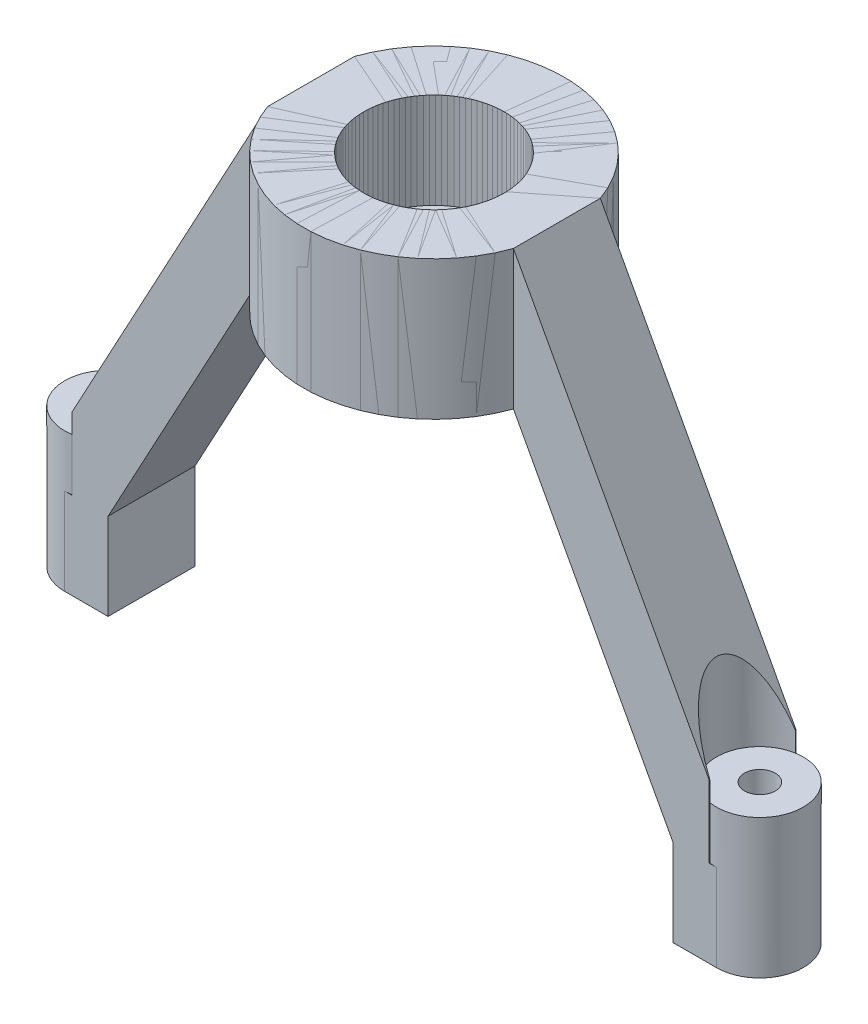
ISO-10303-21;
HEADER;
FILE_DESCRIPTION(('STEP AP214'),'2;1');
FILE_NAME('part.step','',(''),(''),'','','');
FILE_SCHEMA(('AUTOMOTIVE_DESIGN { 1 0 10303 214 1 1 1 1 }'));
ENDSEC;
DATA;
#1=APPLICATION_CONTEXT('core data for automotive mechanical design processes');
#2=APPLICATION_PROTOCOL_DEFINITION('international standard','automotive_design',2000,#1);
#3=PRODUCT_CONTEXT('',#1,'mechanical');
#4=PRODUCT('Part','Part','',(#3));
#5=PRODUCT_RELATED_PRODUCT_CATEGORY('part','',(#4));
#6=PRODUCT_DEFINITION_FORMATION('','',#4);
#7=PRODUCT_DEFINITION_CONTEXT('part definition',#1,'design');
#8=PRODUCT_DEFINITION('design','',#6,#7);
#9=PRODUCT_DEFINITION_SHAPE('','',#8);
#10=(LENGTH_UNIT() NAMED_UNIT(*) SI_UNIT(.MILLI.,.METRE.));
#11=(NAMED_UNIT(*) PLANE_ANGLE_UNIT() SI_UNIT($,.RADIAN.));
#12=(NAMED_UNIT(*) SI_UNIT($,.STERADIAN.) SOLID_ANGLE_UNIT());
#13=UNCERTAINTY_MEASURE_WITH_UNIT(LENGTH_MEASURE(1.E-05),#10,'distance_accuracy_value','');
#14=(GEOMETRIC_REPRESENTATION_CONTEXT(3) GLOBAL_UNCERTAINTY_ASSIGNED_CONTEXT((#13)) GLOBAL_UNIT_ASSIGNED_CONTEXT((#10,
#11,#12)) REPRESENTATION_CONTEXT('',''));
#15=CARTESIAN_POINT('',(0.,0.,0.));
#16=DIRECTION('',(0.,0.,1.));
#17=DIRECTION('',(1.,0.,0.));
#18=AXIS2_PLACEMENT_3D('',#15,#16,#17);
#19=CARTESIAN_POINT('',(18.75,-12.,0.));
#20=DIRECTION('',(0.,-1.,0.));
#21=DIRECTION('',(0.,0.,1.));
#22=AXIS2_PLACEMENT_3D('',#19,#20,#21);
#23=CYLINDRICAL_SURFACE('',#22,0.889);
#24=CARTESIAN_POINT('',(18.75,-14.,0.));
#25=DIRECTION('',(0.,1.,0.));
#26=DIRECTION('',(0.,0.,-1.));
#27=AXIS2_PLACEMENT_3D('',#24,#25,#26);
#28=CIRCLE('',#27,0.889);
#29=CARTESIAN_POINT('',(18.75,-14.,-0.889));
#30=VERTEX_POINT('',#29);
#31=EDGE_CURVE('E267',#30,#30,#28,.T.);
#32=ORIENTED_EDGE('',*,*,#31,.T.);
#33=EDGE_LOOP('',(#32));
#34=FACE_BOUND('',#33,.T.);
#35=CARTESIAN_POINT('',(18.75,-22.,0.));
#36=DIRECTION('',(0.,-1.,0.));
#37=DIRECTION('',(0.,0.,1.));
#38=AXIS2_PLACEMENT_3D('',#35,#36,#37);
#39=CIRCLE('',#38,0.889);
#40=CARTESIAN_POINT('',(18.75,-22.,0.889));
#41=VERTEX_POINT('',#40);
#42=EDGE_CURVE('E239',#41,#41,#39,.T.);
#43=ORIENTED_EDGE('',*,*,#42,.T.);
#44=EDGE_LOOP('',(#43));
#45=FACE_BOUND('',#44,.T.);
#46=ADVANCED_FACE('F45',(#34,#45),#23,.F.);
#47=CARTESIAN_POINT('',(18.75,-12.,0.));
#48=DIRECTION('',(0.,-1.,0.));
#49=DIRECTION('',(0.,0.,1.));
#50=AXIS2_PLACEMENT_3D('',#47,#48,#49);
#51=CYLINDRICAL_SURFACE('',#50,2.5);
#52=CARTESIAN_POINT('',(18.75,-14.,0.));
#53=DIRECTION('',(0.,1.,0.));
#54=DIRECTION('',(0.,0.,-1.));
#55=AXIS2_PLACEMENT_3D('',#52,#53,#54);
#56=CIRCLE('',#55,2.5);
#57=CARTESIAN_POINT('',(18.3373246263292,-14.,2.46570457191563));
#58=VERTEX_POINT('',#57);
#59=CARTESIAN_POINT('',(18.3373246263292,-14.,-2.46570457191563));
#60=VERTEX_POINT('',#59);
#61=EDGE_CURVE('E163',#58,#60,#56,.T.);
#62=ORIENTED_EDGE('',*,*,#61,.F.);
#63=DIRECTION('',(0.,-1.,0.));
#64=VECTOR('',#63,1.);
#65=CARTESIAN_POINT('',(18.3373246263292,-12.,2.46570457191563));
#66=LINE('',#65,#64);
#67=CARTESIAN_POINT('',(18.3373246263292,-17.,2.46570457191563));
#68=VERTEX_POINT('',#67);
#69=EDGE_CURVE('E220',#58,#68,#66,.T.);
#70=ORIENTED_EDGE('',*,*,#69,.T.);
#71=CARTESIAN_POINT('',(18.75,-17.,0.));
#72=DIRECTION('',(0.,1.,0.));
#73=DIRECTION('',(0.,0.,-1.));
#74=AXIS2_PLACEMENT_3D('',#71,#72,#73);
#75=CIRCLE('',#74,2.5);
#76=CARTESIAN_POINT('',(18.75,-17.,2.5));
#77=VERTEX_POINT('',#76);
#78=EDGE_CURVE('E12',#68,#77,#75,.T.);
#79=ORIENTED_EDGE('',*,*,#78,.T.);
#80=DIRECTION('',(0.,1.,0.));
#81=VECTOR('',#80,1.);
#82=CARTESIAN_POINT('',(18.75,-22.,2.5));
#83=LINE('',#82,#81);
#84=CARTESIAN_POINT('',(18.75,-22.,2.5));
#85=VERTEX_POINT('',#84);
#86=EDGE_CURVE('E144',#85,#77,#83,.T.);
#87=ORIENTED_EDGE('',*,*,#86,.F.);
#88=CARTESIAN_POINT('',(18.75,-22.,0.));
#89=DIRECTION('',(0.,-1.,0.));
#90=DIRECTION('',(0.,0.,1.));
#91=AXIS2_PLACEMENT_3D('',#88,#89,#90);
#92=CIRCLE('',#91,2.5);
#93=CARTESIAN_POINT('',(18.75,-22.,-2.5));
#94=VERTEX_POINT('',#93);
#95=EDGE_CURVE('E150',#94,#85,#92,.T.);
#96=ORIENTED_EDGE('',*,*,#95,.F.);
#97=DIRECTION('',(0.,1.,0.));
#98=VECTOR('',#97,1.);
#99=CARTESIAN_POINT('',(18.75,-22.,-2.5));
#100=LINE('',#99,#98);
#101=CARTESIAN_POINT('',(18.75,-17.,-2.5));
#102=VERTEX_POINT('',#101);
#103=EDGE_CURVE('E175',#94,#102,#100,.T.);
#104=ORIENTED_EDGE('',*,*,#103,.T.);
#105=CARTESIAN_POINT('',(18.3373246263292,-17.,-2.46570457191563));
#106=VERTEX_POINT('',#105);
#107=EDGE_CURVE('E53',#102,#106,#75,.T.);
#108=ORIENTED_EDGE('',*,*,#107,.T.);
#109=DIRECTION('',(0.,-1.,0.));
#110=VECTOR('',#109,1.);
#111=CARTESIAN_POINT('',(18.3373246263292,-12.,-2.46570457191563));
#112=LINE('',#111,#110);
#113=EDGE_CURVE('E215',#106,#60,#112,.F.);
#114=ORIENTED_EDGE('',*,*,#113,.T.);
#115=EDGE_LOOP('',(#62,#70,#79,#87,#96,#104,#108,#114));
#116=FACE_BOUND('',#115,.T.);
#117=ADVANCED_FACE('F162',(#116),#51,.T.);
#118=CARTESIAN_POINT('',(18.3373246263292,-12.8658656497612,2.5));
#119=DIRECTION('',(1.,0.,0.));
#120=DIRECTION('',(0.,0.,-1.));
#121=AXIS2_PLACEMENT_3D('',#118,#119,#120);
#122=PLANE('',#121);
#123=CARTESIAN_POINT('',(18.3373246263292,-12.8658656497612,2.46570457191563));
#124=VERTEX_POINT('',#123);
#125=EDGE_CURVE('E319',#124,#58,#66,.T.);
#126=ORIENTED_EDGE('',*,*,#125,.F.);
#127=DIRECTION('',(0.,0.,-1.));
#128=VECTOR('',#127,1.);
#129=CARTESIAN_POINT('',(18.3373246263292,-12.8658656497612,2.5));
#130=LINE('',#129,#128);
#131=CARTESIAN_POINT('',(18.3373246263292,-12.8658656497612,2.5));
#132=VERTEX_POINT('',#131);
#133=EDGE_CURVE('E182',#132,#124,#130,.T.);
#134=ORIENTED_EDGE('',*,*,#133,.F.);
#135=DIRECTION('',(0.,-1.,0.));
#136=VECTOR('',#135,1.);
#137=CARTESIAN_POINT('',(18.3373246263292,-12.8658656497612,2.5));
#138=LINE('',#137,#136);
#139=CARTESIAN_POINT('',(18.3373246263292,-17.,2.5));
#140=VERTEX_POINT('',#139);
#141=EDGE_CURVE('E195',#132,#140,#138,.T.);
#142=ORIENTED_EDGE('',*,*,#141,.T.);
#143=DIRECTION('',(0.,0.,-1.));
#144=VECTOR('',#143,1.);
#145=CARTESIAN_POINT('',(18.3373246263292,-17.,2.5));
#146=LINE('',#145,#144);
#147=EDGE_CURVE('E181',#140,#68,#146,.T.);
#148=ORIENTED_EDGE('',*,*,#147,.T.);
#149=ORIENTED_EDGE('',*,*,#69,.F.);
#150=EDGE_LOOP('',(#126,#134,#142,#148,#149));
#151=FACE_BOUND('',#150,.T.);
#152=ADVANCED_FACE('F264',(#151),#122,.T.);
#153=ORIENTED_EDGE('',*,*,#113,.F.);
#154=CARTESIAN_POINT('',(18.3373246263292,-17.,-2.5));
#155=VERTEX_POINT('',#154);
#156=EDGE_CURVE('E179',#106,#155,#146,.T.);
#157=ORIENTED_EDGE('',*,*,#156,.T.);
#158=DIRECTION('',(0.,-1.,0.));
#159=VECTOR('',#158,1.);
#160=CARTESIAN_POINT('',(18.3373246263292,-12.8658656497612,-2.5));
#161=LINE('',#160,#159);
#162=CARTESIAN_POINT('',(18.3373246263292,-12.8658656497612,-2.5));
#163=VERTEX_POINT('',#162);
#164=EDGE_CURVE('E183',#163,#155,#161,.T.);
#165=ORIENTED_EDGE('',*,*,#164,.F.);
#166=CARTESIAN_POINT('',(18.3373246263292,-12.8658656497612,-2.46570457191563));
#167=VERTEX_POINT('',#166);
#168=EDGE_CURVE('E327',#167,#163,#130,.T.);
#169=ORIENTED_EDGE('',*,*,#168,.F.);
#170=DIRECTION('',(0.,1.,0.));
#171=VECTOR('',#170,1.);
#172=CARTESIAN_POINT('',(18.3373246263292,-14.,-2.46570457191563));
#173=LINE('',#172,#171);
#174=EDGE_CURVE('E270',#60,#167,#173,.T.);
#175=ORIENTED_EDGE('',*,*,#174,.F.);
#176=EDGE_LOOP('',(#153,#157,#165,#169,#175));
#177=FACE_BOUND('',#176,.T.);
#178=ADVANCED_FACE('F315',(#177),#122,.T.);
#179=CARTESIAN_POINT('',(16.25,-17.,2.5));
#180=DIRECTION('',(-0.879928504434249,-0.475106121918153,0.));
#181=DIRECTION('',(-0.475106121918153,0.879928504434249,0.));
#182=AXIS2_PLACEMENT_3D('',#179,#180,#181);
#183=PLANE('',#182);
#184=DIRECTION('',(0.,0.,-1.));
#185=VECTOR('',#184,1.);
#186=CARTESIAN_POINT('',(7.07106781186548,0.,2.5));
#187=LINE('',#186,#185);
#188=CARTESIAN_POINT('',(7.07106781186548,0.,2.5));
#189=VERTEX_POINT('',#188);
#190=CARTESIAN_POINT('',(7.07106781186548,0.,-2.5));
#191=VERTEX_POINT('',#190);
#192=EDGE_CURVE('E214',#189,#191,#187,.T.);
#193=ORIENTED_EDGE('',*,*,#192,.T.);
#194=DIRECTION('',(-0.475106121918153,0.879928504434249,0.));
#195=VECTOR('',#194,1.);
#196=CARTESIAN_POINT('',(16.25,-17.,-2.5));
#197=LINE('',#196,#195);
#198=CARTESIAN_POINT('',(16.25,-17.,-2.5));
#199=VERTEX_POINT('',#198);
#200=EDGE_CURVE('E211',#199,#191,#197,.T.);
#201=ORIENTED_EDGE('',*,*,#200,.F.);
#202=DIRECTION('',(0.,0.,-1.));
#203=VECTOR('',#202,1.);
#204=CARTESIAN_POINT('',(16.25,-17.,2.5));
#205=LINE('',#204,#203);
#206=CARTESIAN_POINT('',(16.25,-17.,2.5));
#207=VERTEX_POINT('',#206);
#208=EDGE_CURVE('E187',#207,#199,#205,.T.);
#209=ORIENTED_EDGE('',*,*,#208,.F.);
#210=DIRECTION('',(-0.475106121918153,0.879928504434249,0.));
#211=VECTOR('',#210,1.);
#212=CARTESIAN_POINT('',(16.25,-17.,2.5));
#213=LINE('',#212,#211);
#214=EDGE_CURVE('E196',#207,#189,#213,.T.);
#215=ORIENTED_EDGE('',*,*,#214,.T.);
#216=EDGE_LOOP('',(#193,#201,#209,#215));
#217=FACE_BOUND('',#216,.T.);
#218=ADVANCED_FACE('F367',(#217),#183,.T.);
#219=CARTESIAN_POINT('',(7.07106781186548,8.,2.5));
#220=DIRECTION('',(0.879928504434249,0.475106121918153,0.));
#221=DIRECTION('',(0.475106121918153,-0.879928504434249,0.));
#222=AXIS2_PLACEMENT_3D('',#219,#220,#221);
#223=PLANE('',#222);
#224=CARTESIAN_POINT('',(18.75,-13.6301682079032,0.));
#225=DIRECTION('',(0.879928504434249,0.475106121918153,0.));
#226=DIRECTION('',(0.475106121918153,-0.879928504434249,0.));
#227=AXIS2_PLACEMENT_3D('',#224,#225,#226);
#228=ELLIPSE('',#227,5.26198229125466,2.5);
#229=EDGE_CURVE('E318',#167,#124,#228,.T.);
#230=ORIENTED_EDGE('',*,*,#229,.F.);
#231=ORIENTED_EDGE('',*,*,#168,.T.);
#232=DIRECTION('',(0.475106121918153,-0.879928504434249,0.));
#233=VECTOR('',#232,1.);
#234=CARTESIAN_POINT('',(7.07106781186548,8.,-2.5));
#235=LINE('',#234,#233);
#236=CARTESIAN_POINT('',(7.07106781186548,8.,-2.5));
#237=VERTEX_POINT('',#236);
#238=EDGE_CURVE('E308',#237,#163,#235,.T.);
#239=ORIENTED_EDGE('',*,*,#238,.F.);
#240=DIRECTION('',(0.,0.,-1.));
#241=VECTOR('',#240,1.);
#242=CARTESIAN_POINT('',(7.07106781186548,8.,2.5));
#243=LINE('',#242,#241);
#244=CARTESIAN_POINT('',(7.07106781186548,8.,2.5));
#245=VERTEX_POINT('',#244);
#246=EDGE_CURVE('E202',#245,#237,#243,.T.);
#247=ORIENTED_EDGE('',*,*,#246,.F.);
#248=DIRECTION('',(0.475106121918153,-0.879928504434249,0.));
#249=VECTOR('',#248,1.);
#250=CARTESIAN_POINT('',(7.07106781186548,8.,2.5));
#251=LINE('',#250,#249);
#252=EDGE_CURVE('E197',#245,#132,#251,.T.);
#253=ORIENTED_EDGE('',*,*,#252,.T.);
#254=ORIENTED_EDGE('',*,*,#133,.T.);
#255=EDGE_LOOP('',(#230,#231,#239,#247,#253,#254));
#256=FACE_BOUND('',#255,.T.);
#257=ADVANCED_FACE('F329',(#256),#223,.T.);
#258=CARTESIAN_POINT('',(0.,0.,2.5));
#259=DIRECTION('',(0.,0.,1.));
#260=DIRECTION('',(1.,0.,0.));
#261=AXIS2_PLACEMENT_3D('',#258,#259,#260);
#262=PLANE('',#261);
#263=DIRECTION('',(0.,1.,0.));
#264=VECTOR('',#263,1.);
#265=CARTESIAN_POINT('',(7.07106781186548,0.,2.5));
#266=LINE('',#265,#264);
#267=EDGE_CURVE('E205',#189,#245,#266,.T.);
#268=ORIENTED_EDGE('',*,*,#267,.F.);
#269=ORIENTED_EDGE('',*,*,#214,.F.);
#270=DIRECTION('',(0.,1.,0.));
#271=VECTOR('',#270,1.);
#272=CARTESIAN_POINT('',(16.25,-22.,2.5));
#273=LINE('',#272,#271);
#274=CARTESIAN_POINT('',(16.25,-22.,2.5));
#275=VERTEX_POINT('',#274);
#276=EDGE_CURVE('E146',#275,#207,#273,.T.);
#277=ORIENTED_EDGE('',*,*,#276,.F.);
#278=DIRECTION('',(-1.,0.,0.));
#279=VECTOR('',#278,1.);
#280=CARTESIAN_POINT('',(18.75,-22.,2.5));
#281=LINE('',#280,#279);
#282=EDGE_CURVE('E140',#85,#275,#281,.T.);
#283=ORIENTED_EDGE('',*,*,#282,.F.);
#284=ORIENTED_EDGE('',*,*,#86,.T.);
#285=DIRECTION('',(-1.,0.,0.));
#286=VECTOR('',#285,1.);
#287=CARTESIAN_POINT('',(18.75,-17.,2.5));
#288=LINE('',#287,#286);
#289=EDGE_CURVE('E238',#77,#140,#288,.T.);
#290=ORIENTED_EDGE('',*,*,#289,.T.);
#291=ORIENTED_EDGE('',*,*,#141,.F.);
#292=ORIENTED_EDGE('',*,*,#252,.F.);
#293=EDGE_LOOP('',(#268,#269,#277,#283,#284,#290,#291,#292));
#294=FACE_BOUND('',#293,.T.);
#295=ADVANCED_FACE('F142',(#294),#262,.T.);
#296=CARTESIAN_POINT('',(0.,0.,-2.5));
#297=DIRECTION('',(0.,0.,1.));
#298=DIRECTION('',(1.,0.,0.));
#299=AXIS2_PLACEMENT_3D('',#296,#297,#298);
#300=PLANE('',#299);
#301=DIRECTION('',(0.,1.,0.));
#302=VECTOR('',#301,1.);
#303=CARTESIAN_POINT('',(7.07106781186548,0.,-2.5));
#304=LINE('',#303,#302);
#305=EDGE_CURVE('E304',#191,#237,#304,.T.);
#306=ORIENTED_EDGE('',*,*,#305,.T.);
#307=ORIENTED_EDGE('',*,*,#238,.T.);
#308=ORIENTED_EDGE('',*,*,#164,.T.);
#309=DIRECTION('',(1.,0.,0.));
#310=VECTOR('',#309,1.);
#311=CARTESIAN_POINT('',(16.25,-17.,-2.5));
#312=LINE('',#311,#310);
#313=EDGE_CURVE('E159',#155,#102,#312,.T.);
#314=ORIENTED_EDGE('',*,*,#313,.T.);
#315=ORIENTED_EDGE('',*,*,#103,.F.);
#316=DIRECTION('',(1.,0.,0.));
#317=VECTOR('',#316,1.);
#318=CARTESIAN_POINT('',(16.25,-22.,-2.5));
#319=LINE('',#318,#317);
#320=CARTESIAN_POINT('',(16.25,-22.,-2.5));
#321=VERTEX_POINT('',#320);
#322=EDGE_CURVE('E156',#321,#94,#319,.T.);
#323=ORIENTED_EDGE('',*,*,#322,.F.);
#324=DIRECTION('',(0.,1.,0.));
#325=VECTOR('',#324,1.);
#326=CARTESIAN_POINT('',(16.25,-22.,-2.5));
#327=LINE('',#326,#325);
#328=EDGE_CURVE('E167',#321,#199,#327,.T.);
#329=ORIENTED_EDGE('',*,*,#328,.T.);
#330=ORIENTED_EDGE('',*,*,#200,.T.);
#331=EDGE_LOOP('',(#306,#307,#308,#314,#315,#323,#329,#330));
#332=FACE_BOUND('',#331,.T.);
#333=ADVANCED_FACE('F230',(#332),#300,.F.);
#334=CARTESIAN_POINT('',(0.,8.,0.));
#335=DIRECTION('',(0.,-1.,0.));
#336=DIRECTION('',(0.,0.,1.));
#337=AXIS2_PLACEMENT_3D('',#334,#335,#336);
#338=CYLINDRICAL_SURFACE('',#337,1.875);
#339=CARTESIAN_POINT('',(0.,0.,0.));
#340=DIRECTION('',(0.,1.,0.));
#341=DIRECTION('',(0.,0.,-1.));
#342=AXIS2_PLACEMENT_3D('',#339,#340,#341);
#343=CIRCLE('',#342,1.875);
#344=CARTESIAN_POINT('',(0.,0.,-1.875));
#345=VERTEX_POINT('',#344);
#346=EDGE_CURVE('E290',#345,#345,#343,.T.);
#347=ORIENTED_EDGE('',*,*,#346,.F.);
#348=EDGE_LOOP('',(#347));
#349=FACE_BOUND('',#348,.T.);
#350=CARTESIAN_POINT('',(0.,2.5,0.));
#351=DIRECTION('',(0.,1.,0.));
#352=DIRECTION('',(0.,0.,-1.));
#353=AXIS2_PLACEMENT_3D('',#350,#351,#352);
#354=CIRCLE('',#353,1.875);
#355=CARTESIAN_POINT('',(0.,2.5,-1.875));
#356=VERTEX_POINT('',#355);
#357=EDGE_CURVE('E278',#356,#356,#354,.T.);
#358=ORIENTED_EDGE('',*,*,#357,.T.);
#359=EDGE_LOOP('',(#358));
#360=FACE_BOUND('',#359,.T.);
#361=ADVANCED_FACE('F359',(#349,#360),#338,.F.);
#362=CARTESIAN_POINT('',(-7.07106781186548,8.,0.));
#363=DIRECTION('',(-1.,0.,0.));
#364=DIRECTION('',(0.,0.,1.));
#365=AXIS2_PLACEMENT_3D('',#362,#363,#364);
#366=PLANE('',#365);
#367=DIRECTION('',(0.,0.,-1.));
#368=VECTOR('',#367,1.);
#369=CARTESIAN_POINT('',(-7.07106781186548,0.,0.));
#370=LINE('',#369,#368);
#371=CARTESIAN_POINT('',(-7.07106781186548,0.,2.5));
#372=VERTEX_POINT('',#371);
#373=CARTESIAN_POINT('',(-7.07106781186548,0.,-2.5));
#374=VERTEX_POINT('',#373);
#375=EDGE_CURVE('E293',#372,#374,#370,.T.);
#376=ORIENTED_EDGE('',*,*,#375,.F.);
#377=DIRECTION('',(0.,-1.,0.));
#378=VECTOR('',#377,1.);
#379=CARTESIAN_POINT('',(-7.07106781186548,8.,2.5));
#380=LINE('',#379,#378);
#381=CARTESIAN_POINT('',(-7.07106781186548,8.,2.5));
#382=VERTEX_POINT('',#381);
#383=EDGE_CURVE('E302',#382,#372,#380,.T.);
#384=ORIENTED_EDGE('',*,*,#383,.F.);
#385=DIRECTION('',(0.,0.,-1.));
#386=VECTOR('',#385,1.);
#387=CARTESIAN_POINT('',(-7.07106781186548,8.,0.));
#388=LINE('',#387,#386);
#389=CARTESIAN_POINT('',(-7.07106781186548,8.,-2.5));
#390=VERTEX_POINT('',#389);
#391=EDGE_CURVE('E280',#382,#390,#388,.T.);
#392=ORIENTED_EDGE('',*,*,#391,.T.);
#393=DIRECTION('',(0.,-1.,0.));
#394=VECTOR('',#393,1.);
#395=CARTESIAN_POINT('',(-7.07106781186548,8.,-2.5));
#396=LINE('',#395,#394);
#397=EDGE_CURVE('E289',#390,#374,#396,.T.);
#398=ORIENTED_EDGE('',*,*,#397,.T.);
#399=EDGE_LOOP('',(#376,#384,#392,#398));
#400=FACE_BOUND('',#399,.T.);
#401=ADVANCED_FACE('F340',(#400),#366,.T.);
#402=CARTESIAN_POINT('',(0.,8.,0.));
#403=DIRECTION('',(0.,-1.,0.));
#404=DIRECTION('',(0.,0.,1.));
#405=AXIS2_PLACEMENT_3D('',#402,#403,#404);
#406=CYLINDRICAL_SURFACE('',#405,7.5);
#407=CARTESIAN_POINT('',(0.,0.,0.));
#408=DIRECTION('',(0.,1.,0.));
#409=DIRECTION('',(0.,0.,-1.));
#410=AXIS2_PLACEMENT_3D('',#407,#408,#409);
#411=CIRCLE('',#410,7.5);
#412=EDGE_CURVE('E296',#372,#189,#411,.T.);
#413=ORIENTED_EDGE('',*,*,#412,.T.);
#414=ORIENTED_EDGE('',*,*,#267,.T.);
#415=CARTESIAN_POINT('',(0.,8.,0.));
#416=DIRECTION('',(0.,1.,0.));
#417=DIRECTION('',(0.,0.,-1.));
#418=AXIS2_PLACEMENT_3D('',#415,#416,#417);
#419=CIRCLE('',#418,7.5);
#420=EDGE_CURVE('E283',#382,#245,#419,.T.);
#421=ORIENTED_EDGE('',*,*,#420,.F.);
#422=ORIENTED_EDGE('',*,*,#383,.T.);
#423=EDGE_LOOP('',(#413,#414,#421,#422));
#424=FACE_BOUND('',#423,.T.);
#425=ADVANCED_FACE('F334',(#424),#406,.T.);
#426=CARTESIAN_POINT('',(0.,8.,0.));
#427=DIRECTION('',(0.,-1.,0.));
#428=DIRECTION('',(0.,0.,1.));
#429=AXIS2_PLACEMENT_3D('',#426,#427,#428);
#430=CYLINDRICAL_SURFACE('',#429,7.5);
#431=CARTESIAN_POINT('',(0.,0.,0.));
#432=DIRECTION('',(0.,1.,0.));
#433=DIRECTION('',(0.,0.,-1.));
#434=AXIS2_PLACEMENT_3D('',#431,#432,#433);
#435=CIRCLE('',#434,7.5);
#436=EDGE_CURVE('E284',#191,#374,#435,.T.);
#437=ORIENTED_EDGE('',*,*,#436,.T.);
#438=ORIENTED_EDGE('',*,*,#397,.F.);
#439=CARTESIAN_POINT('',(0.,8.,0.));
#440=DIRECTION('',(0.,1.,0.));
#441=DIRECTION('',(0.,0.,-1.));
#442=AXIS2_PLACEMENT_3D('',#439,#440,#441);
#443=CIRCLE('',#442,7.5);
#444=EDGE_CURVE('E287',#237,#390,#443,.T.);
#445=ORIENTED_EDGE('',*,*,#444,.F.);
#446=ORIENTED_EDGE('',*,*,#305,.F.);
#447=EDGE_LOOP('',(#437,#438,#445,#446));
#448=FACE_BOUND('',#447,.T.);
#449=ADVANCED_FACE('F345',(#448),#430,.T.);
#450=CARTESIAN_POINT('',(0.,8.,0.));
#451=DIRECTION('',(0.,1.,0.));
#452=DIRECTION('',(0.,0.,-1.));
#453=AXIS2_PLACEMENT_3D('',#450,#451,#452);
#454=PLANE('',#453);
#455=CARTESIAN_POINT('',(0.,8.,0.));
#456=DIRECTION('',(0.,1.,0.));
#457=DIRECTION('',(0.,0.,-1.));
#458=AXIS2_PLACEMENT_3D('',#455,#456,#457);
#459=CIRCLE('',#458,4.05);
#460=CARTESIAN_POINT('',(0.,8.,-4.05));
#461=VERTEX_POINT('',#460);
#462=EDGE_CURVE('E269',#461,#461,#459,.T.);
#463=ORIENTED_EDGE('',*,*,#462,.F.);
#464=EDGE_LOOP('',(#463));
#465=FACE_BOUND('',#464,.T.);
#466=ORIENTED_EDGE('',*,*,#391,.F.);
#467=ORIENTED_EDGE('',*,*,#420,.T.);
#468=ORIENTED_EDGE('',*,*,#246,.T.);
#469=ORIENTED_EDGE('',*,*,#444,.T.);
#470=EDGE_LOOP('',(#466,#467,#468,#469));
#471=FACE_BOUND('',#470,.T.);
#472=ADVANCED_FACE('F332',(#465,#471),#454,.T.);
#473=CARTESIAN_POINT('',(0.,0.,0.));
#474=DIRECTION('',(0.,1.,0.));
#475=DIRECTION('',(0.,0.,-1.));
#476=AXIS2_PLACEMENT_3D('',#473,#474,#475);
#477=PLANE('',#476);
#478=ORIENTED_EDGE('',*,*,#346,.T.);
#479=EDGE_LOOP('',(#478));
#480=FACE_BOUND('',#479,.T.);
#481=ORIENTED_EDGE('',*,*,#375,.T.);
#482=ORIENTED_EDGE('',*,*,#436,.F.);
#483=ORIENTED_EDGE('',*,*,#192,.F.);
#484=ORIENTED_EDGE('',*,*,#412,.F.);
#485=EDGE_LOOP('',(#481,#482,#483,#484));
#486=FACE_BOUND('',#485,.T.);
#487=ADVANCED_FACE('F338',(#480,#486),#477,.F.);
#488=CARTESIAN_POINT('',(0.,2.5,0.));
#489=DIRECTION('',(0.,1.,0.));
#490=DIRECTION('',(0.,0.,-1.));
#491=AXIS2_PLACEMENT_3D('',#488,#489,#490);
#492=CYLINDRICAL_SURFACE('',#491,4.05);
#493=CARTESIAN_POINT('',(0.,2.5,0.));
#494=DIRECTION('',(0.,1.,0.));
#495=DIRECTION('',(0.,0.,-1.));
#496=AXIS2_PLACEMENT_3D('',#493,#494,#495);
#497=CIRCLE('',#496,4.05);
#498=CARTESIAN_POINT('',(0.,2.5,-4.05));
#499=VERTEX_POINT('',#498);
#500=EDGE_CURVE('E273',#499,#499,#497,.T.);
#501=ORIENTED_EDGE('',*,*,#500,.F.);
#502=EDGE_LOOP('',(#501));
#503=FACE_BOUND('',#502,.T.);
#504=ORIENTED_EDGE('',*,*,#462,.T.);
#505=EDGE_LOOP('',(#504));
#506=FACE_BOUND('',#505,.T.);
#507=ADVANCED_FACE('F417',(#503,#506),#492,.F.);
#508=CARTESIAN_POINT('',(0.,2.5,0.));
#509=DIRECTION('',(0.,1.,0.));
#510=DIRECTION('',(0.,0.,-1.));
#511=AXIS2_PLACEMENT_3D('',#508,#509,#510);
#512=PLANE('',#511);
#513=ORIENTED_EDGE('',*,*,#357,.F.);
#514=EDGE_LOOP('',(#513));
#515=FACE_BOUND('',#514,.T.);
#516=ORIENTED_EDGE('',*,*,#500,.T.);
#517=EDGE_LOOP('',(#516));
#518=FACE_BOUND('',#517,.T.);
#519=ADVANCED_FACE('F426',(#515,#518),#512,.T.);
#520=CARTESIAN_POINT('',(18.75,-14.,0.));
#521=DIRECTION('',(0.,1.,0.));
#522=DIRECTION('',(0.,0.,-1.));
#523=AXIS2_PLACEMENT_3D('',#520,#521,#522);
#524=CYLINDRICAL_SURFACE('',#523,2.5);
#525=ORIENTED_EDGE('',*,*,#125,.T.);
#526=EDGE_CURVE('E165',#60,#58,#56,.T.);
#527=ORIENTED_EDGE('',*,*,#526,.F.);
#528=ORIENTED_EDGE('',*,*,#174,.T.);
#529=ORIENTED_EDGE('',*,*,#229,.T.);
#530=EDGE_LOOP('',(#525,#527,#528,#529));
#531=FACE_BOUND('',#530,.T.);
#532=ADVANCED_FACE('F436',(#531),#524,.F.);
#533=CARTESIAN_POINT('',(18.75,-14.,0.));
#534=DIRECTION('',(0.,1.,0.));
#535=DIRECTION('',(0.,0.,-1.));
#536=AXIS2_PLACEMENT_3D('',#533,#534,#535);
#537=PLANE('',#536);
#538=ORIENTED_EDGE('',*,*,#31,.F.);
#539=EDGE_LOOP('',(#538));
#540=FACE_BOUND('',#539,.T.);
#541=ORIENTED_EDGE('',*,*,#526,.T.);
#542=ORIENTED_EDGE('',*,*,#61,.T.);
#543=EDGE_LOOP('',(#541,#542));
#544=FACE_BOUND('',#543,.T.);
#545=ADVANCED_FACE('F257',(#540,#544),#537,.T.);
#546=CARTESIAN_POINT('',(18.75,-17.,0.));
#547=DIRECTION('',(0.,-1.,0.));
#548=DIRECTION('',(0.,0.,1.));
#549=AXIS2_PLACEMENT_3D('',#546,#547,#548);
#550=PLANE('',#549);
#551=ORIENTED_EDGE('',*,*,#78,.F.);
#552=ORIENTED_EDGE('',*,*,#147,.F.);
#553=ORIENTED_EDGE('',*,*,#289,.F.);
#554=EDGE_LOOP('',(#551,#552,#553));
#555=FACE_BOUND('',#554,.T.);
#556=ADVANCED_FACE('F250',(#555),#550,.F.);
#557=CARTESIAN_POINT('',(18.75,-22.,0.));
#558=DIRECTION('',(0.,-1.,0.));
#559=DIRECTION('',(0.,0.,1.));
#560=AXIS2_PLACEMENT_3D('',#557,#558,#559);
#561=PLANE('',#560);
#562=ORIENTED_EDGE('',*,*,#95,.T.);
#563=ORIENTED_EDGE('',*,*,#282,.T.);
#564=DIRECTION('',(0.,0.,-1.));
#565=VECTOR('',#564,1.);
#566=CARTESIAN_POINT('',(16.25,-22.,2.5));
#567=LINE('',#566,#565);
#568=EDGE_CURVE('E149',#275,#321,#567,.T.);
#569=ORIENTED_EDGE('',*,*,#568,.T.);
#570=ORIENTED_EDGE('',*,*,#322,.T.);
#571=EDGE_LOOP('',(#562,#563,#569,#570));
#572=FACE_BOUND('',#571,.T.);
#573=ORIENTED_EDGE('',*,*,#42,.F.);
#574=EDGE_LOOP('',(#573));
#575=FACE_BOUND('',#574,.T.);
#576=ADVANCED_FACE('F153',(#572,#575),#561,.T.);
#577=ORIENTED_EDGE('',*,*,#107,.F.);
#578=ORIENTED_EDGE('',*,*,#313,.F.);
#579=ORIENTED_EDGE('',*,*,#156,.F.);
#580=EDGE_LOOP('',(#577,#578,#579));
#581=FACE_BOUND('',#580,.T.);
#582=ADVANCED_FACE('F249',(#581),#550,.F.);
#583=CARTESIAN_POINT('',(16.25,-22.,2.5));
#584=DIRECTION('',(1.,0.,0.));
#585=DIRECTION('',(0.,0.,-1.));
#586=AXIS2_PLACEMENT_3D('',#583,#584,#585);
#587=PLANE('',#586);
#588=ORIENTED_EDGE('',*,*,#208,.T.);
#589=ORIENTED_EDGE('',*,*,#328,.F.);
#590=ORIENTED_EDGE('',*,*,#568,.F.);
#591=ORIENTED_EDGE('',*,*,#276,.T.);
#592=EDGE_LOOP('',(#588,#589,#590,#591));
#593=FACE_BOUND('',#592,.T.);
#594=ADVANCED_FACE('F227',(#593),#587,.F.);
#595=CLOSED_SHELL('',(#46,#117,#152,#178,#218,#257,#295,#333,#361,#401,#425,#449,#472,#487,#507,
#519,#532,#545,#556,#576,#582,#594));
#596=MANIFOLD_SOLID_BREP('B2',#595);
#597=CARTESIAN_POINT('',(-18.75,-12.,0.));
#598=DIRECTION('',(0.,-1.,0.));
#599=DIRECTION('',(0.,0.,-1.));
#600=AXIS2_PLACEMENT_3D('',#597,#598,#599);
#601=CYLINDRICAL_SURFACE('',#600,0.889);
#602=CARTESIAN_POINT('',(-18.75,-14.,0.));
#603=DIRECTION('',(0.,1.,0.));
#604=DIRECTION('',(0.,0.,1.));
#605=AXIS2_PLACEMENT_3D('',#602,#603,#604);
#606=CIRCLE('',#605,0.889);
#607=CARTESIAN_POINT('',(-18.75,-14.,0.889));
#608=VERTEX_POINT('',#607);
#609=EDGE_CURVE('E767',#608,#608,#606,.T.);
#610=ORIENTED_EDGE('',*,*,#609,.T.);
#611=EDGE_LOOP('',(#610));
#612=FACE_BOUND('',#611,.T.);
#613=CARTESIAN_POINT('',(-18.75,-22.,0.));
#614=DIRECTION('',(0.,-1.,0.));
#615=DIRECTION('',(0.,0.,-1.));
#616=AXIS2_PLACEMENT_3D('',#613,#614,#615);
#617=CIRCLE('',#616,0.889);
#618=CARTESIAN_POINT('',(-18.75,-22.,-0.889));
#619=VERTEX_POINT('',#618);
#620=EDGE_CURVE('E739',#619,#619,#617,.T.);
#621=ORIENTED_EDGE('',*,*,#620,.T.);
#622=EDGE_LOOP('',(#621));
#623=FACE_BOUND('',#622,.T.);
#624=ADVANCED_FACE('F545',(#612,#623),#601,.F.);
#625=CARTESIAN_POINT('',(-18.75,-12.,0.));
#626=DIRECTION('',(0.,-1.,0.));
#627=DIRECTION('',(0.,0.,-1.));
#628=AXIS2_PLACEMENT_3D('',#625,#626,#627);
#629=CYLINDRICAL_SURFACE('',#628,2.5);
#630=CARTESIAN_POINT('',(-18.75,-14.,0.));
#631=DIRECTION('',(0.,1.,0.));
#632=DIRECTION('',(0.,0.,1.));
#633=AXIS2_PLACEMENT_3D('',#630,#631,#632);
#634=CIRCLE('',#633,2.5);
#635=CARTESIAN_POINT('',(-18.3373246263292,-14.,-2.46570457191563));
#636=VERTEX_POINT('',#635);
#637=CARTESIAN_POINT('',(-18.3373246263292,-14.,2.46570457191563));
#638=VERTEX_POINT('',#637);
#639=EDGE_CURVE('E663',#636,#638,#634,.T.);
#640=ORIENTED_EDGE('',*,*,#639,.F.);
#641=DIRECTION('',(0.,-1.,0.));
#642=VECTOR('',#641,1.);
#643=CARTESIAN_POINT('',(-18.3373246263292,-12.,-2.46570457191563));
#644=LINE('',#643,#642);
#645=CARTESIAN_POINT('',(-18.3373246263292,-17.,-2.46570457191563));
#646=VERTEX_POINT('',#645);
#647=EDGE_CURVE('E720',#636,#646,#644,.T.);
#648=ORIENTED_EDGE('',*,*,#647,.T.);
#649=CARTESIAN_POINT('',(-18.75,-17.,0.));
#650=DIRECTION('',(0.,1.,0.));
#651=DIRECTION('',(0.,0.,1.));
#652=AXIS2_PLACEMENT_3D('',#649,#650,#651);
#653=CIRCLE('',#652,2.5);
#654=CARTESIAN_POINT('',(-18.75,-17.,-2.5));
#655=VERTEX_POINT('',#654);
#656=EDGE_CURVE('E43',#646,#655,#653,.T.);
#657=ORIENTED_EDGE('',*,*,#656,.T.);
#658=DIRECTION('',(0.,1.,0.));
#659=VECTOR('',#658,1.);
#660=CARTESIAN_POINT('',(-18.75,-22.,-2.5));
#661=LINE('',#660,#659);
#662=CARTESIAN_POINT('',(-18.75,-22.,-2.5));
#663=VERTEX_POINT('',#662);
#664=EDGE_CURVE('E644',#663,#655,#661,.T.);
#665=ORIENTED_EDGE('',*,*,#664,.F.);
#666=CARTESIAN_POINT('',(-18.75,-22.,0.));
#667=DIRECTION('',(0.,-1.,0.));
#668=DIRECTION('',(0.,0.,-1.));
#669=AXIS2_PLACEMENT_3D('',#666,#667,#668);
#670=CIRCLE('',#669,2.5);
#671=CARTESIAN_POINT('',(-18.75,-22.,2.5));
#672=VERTEX_POINT('',#671);
#673=EDGE_CURVE('E650',#672,#663,#670,.T.);
#674=ORIENTED_EDGE('',*,*,#673,.F.);
#675=DIRECTION('',(0.,1.,0.));
#676=VECTOR('',#675,1.);
#677=CARTESIAN_POINT('',(-18.75,-22.,2.5));
#678=LINE('',#677,#676);
#679=CARTESIAN_POINT('',(-18.75,-17.,2.5));
#680=VERTEX_POINT('',#679);
#681=EDGE_CURVE('E675',#672,#680,#678,.T.);
#682=ORIENTED_EDGE('',*,*,#681,.T.);
#683=CARTESIAN_POINT('',(-18.3373246263292,-17.,2.46570457191563));
#684=VERTEX_POINT('',#683);
#685=EDGE_CURVE('E553',#680,#684,#653,.T.);
#686=ORIENTED_EDGE('',*,*,#685,.T.);
#687=DIRECTION('',(0.,-1.,0.));
#688=VECTOR('',#687,1.);
#689=CARTESIAN_POINT('',(-18.3373246263292,-12.,2.46570457191563));
#690=LINE('',#689,#688);
#691=EDGE_CURVE('E715',#684,#638,#690,.F.);
#692=ORIENTED_EDGE('',*,*,#691,.T.);
#693=EDGE_LOOP('',(#640,#648,#657,#665,#674,#682,#686,#692));
#694=FACE_BOUND('',#693,.T.);
#695=ADVANCED_FACE('F662',(#694),#629,.T.);
#696=CARTESIAN_POINT('',(-18.3373246263292,-12.8658656497612,-2.5));
#697=DIRECTION('',(-1.,0.,0.));
#698=DIRECTION('',(0.,0.,1.));
#699=AXIS2_PLACEMENT_3D('',#696,#697,#698);
#700=PLANE('',#699);
#701=CARTESIAN_POINT('',(-18.3373246263292,-12.8658656497612,-2.46570457191563));
#702=VERTEX_POINT('',#701);
#703=EDGE_CURVE('E819',#702,#636,#644,.T.);
#704=ORIENTED_EDGE('',*,*,#703,.F.);
#705=DIRECTION('',(0.,0.,1.));
#706=VECTOR('',#705,1.);
#707=CARTESIAN_POINT('',(-18.3373246263292,-12.8658656497612,-2.5));
#708=LINE('',#707,#706);
#709=CARTESIAN_POINT('',(-18.3373246263292,-12.8658656497612,-2.5));
#710=VERTEX_POINT('',#709);
#711=EDGE_CURVE('E682',#710,#702,#708,.T.);
#712=ORIENTED_EDGE('',*,*,#711,.F.);
#713=DIRECTION('',(0.,-1.,0.));
#714=VECTOR('',#713,1.);
#715=CARTESIAN_POINT('',(-18.3373246263292,-12.8658656497612,-2.5));
#716=LINE('',#715,#714);
#717=CARTESIAN_POINT('',(-18.3373246263292,-17.,-2.5));
#718=VERTEX_POINT('',#717);
#719=EDGE_CURVE('E695',#710,#718,#716,.T.);
#720=ORIENTED_EDGE('',*,*,#719,.T.);
#721=DIRECTION('',(0.,0.,1.));
#722=VECTOR('',#721,1.);
#723=CARTESIAN_POINT('',(-18.3373246263292,-17.,-2.5));
#724=LINE('',#723,#722);
#725=EDGE_CURVE('E681',#718,#646,#724,.T.);
#726=ORIENTED_EDGE('',*,*,#725,.T.);
#727=ORIENTED_EDGE('',*,*,#647,.F.);
#728=EDGE_LOOP('',(#704,#712,#720,#726,#727));
#729=FACE_BOUND('',#728,.T.);
#730=ADVANCED_FACE('F764',(#729),#700,.T.);
#731=ORIENTED_EDGE('',*,*,#691,.F.);
#732=CARTESIAN_POINT('',(-18.3373246263292,-17.,2.5));
#733=VERTEX_POINT('',#732);
#734=EDGE_CURVE('E679',#684,#733,#724,.T.);
#735=ORIENTED_EDGE('',*,*,#734,.T.);
#736=DIRECTION('',(0.,-1.,0.));
#737=VECTOR('',#736,1.);
#738=CARTESIAN_POINT('',(-18.3373246263292,-12.8658656497612,2.5));
#739=LINE('',#738,#737);
#740=CARTESIAN_POINT('',(-18.3373246263292,-12.8658656497612,2.5));
#741=VERTEX_POINT('',#740);
#742=EDGE_CURVE('E683',#741,#733,#739,.T.);
#743=ORIENTED_EDGE('',*,*,#742,.F.);
#744=CARTESIAN_POINT('',(-18.3373246263292,-12.8658656497612,2.46570457191563));
#745=VERTEX_POINT('',#744);
#746=EDGE_CURVE('E827',#745,#741,#708,.T.);
#747=ORIENTED_EDGE('',*,*,#746,.F.);
#748=DIRECTION('',(0.,1.,0.));
#749=VECTOR('',#748,1.);
#750=CARTESIAN_POINT('',(-18.3373246263292,-14.,2.46570457191563));
#751=LINE('',#750,#749);
#752=EDGE_CURVE('E770',#638,#745,#751,.T.);
#753=ORIENTED_EDGE('',*,*,#752,.F.);
#754=EDGE_LOOP('',(#731,#735,#743,#747,#753));
#755=FACE_BOUND('',#754,.T.);
#756=ADVANCED_FACE('F815',(#755),#700,.T.);
#757=CARTESIAN_POINT('',(-16.25,-17.,-2.5));
#758=DIRECTION('',(0.879928504434249,-0.475106121918153,0.));
#759=DIRECTION('',(0.475106121918153,0.879928504434249,0.));
#760=AXIS2_PLACEMENT_3D('',#757,#758,#759);
#761=PLANE('',#760);
#762=DIRECTION('',(0.,0.,1.));
#763=VECTOR('',#762,1.);
#764=CARTESIAN_POINT('',(-7.07106781186548,0.,-2.5));
#765=LINE('',#764,#763);
#766=CARTESIAN_POINT('',(-7.07106781186548,0.,-2.5));
#767=VERTEX_POINT('',#766);
#768=CARTESIAN_POINT('',(-7.07106781186548,0.,2.5));
#769=VERTEX_POINT('',#768);
#770=EDGE_CURVE('E714',#767,#769,#765,.T.);
#771=ORIENTED_EDGE('',*,*,#770,.T.);
#772=DIRECTION('',(0.475106121918153,0.879928504434249,0.));
#773=VECTOR('',#772,1.);
#774=CARTESIAN_POINT('',(-16.25,-17.,2.5));
#775=LINE('',#774,#773);
#776=CARTESIAN_POINT('',(-16.25,-17.,2.5));
#777=VERTEX_POINT('',#776);
#778=EDGE_CURVE('E711',#777,#769,#775,.T.);
#779=ORIENTED_EDGE('',*,*,#778,.F.);
#780=DIRECTION('',(0.,0.,1.));
#781=VECTOR('',#780,1.);
#782=CARTESIAN_POINT('',(-16.25,-17.,-2.5));
#783=LINE('',#782,#781);
#784=CARTESIAN_POINT('',(-16.25,-17.,-2.5));
#785=VERTEX_POINT('',#784);
#786=EDGE_CURVE('E687',#785,#777,#783,.T.);
#787=ORIENTED_EDGE('',*,*,#786,.F.);
#788=DIRECTION('',(0.475106121918153,0.879928504434249,0.));
#789=VECTOR('',#788,1.);
#790=CARTESIAN_POINT('',(-16.25,-17.,-2.5));
#791=LINE('',#790,#789);
#792=EDGE_CURVE('E696',#785,#767,#791,.T.);
#793=ORIENTED_EDGE('',*,*,#792,.T.);
#794=EDGE_LOOP('',(#771,#779,#787,#793));
#795=FACE_BOUND('',#794,.T.);
#796=ADVANCED_FACE('F867',(#795),#761,.T.);
#797=CARTESIAN_POINT('',(-7.07106781186548,8.,-2.5));
#798=DIRECTION('',(-0.879928504434249,0.475106121918153,0.));
#799=DIRECTION('',(-0.475106121918153,-0.879928504434249,0.));
#800=AXIS2_PLACEMENT_3D('',#797,#798,#799);
#801=PLANE('',#800);
#802=CARTESIAN_POINT('',(-18.75,-13.6301682079032,0.));
#803=DIRECTION('',(-0.879928504434249,0.475106121918153,0.));
#804=DIRECTION('',(-0.475106121918153,-0.879928504434249,0.));
#805=AXIS2_PLACEMENT_3D('',#802,#803,#804);
#806=ELLIPSE('',#805,5.26198229125466,2.5);
#807=EDGE_CURVE('E818',#745,#702,#806,.T.);
#808=ORIENTED_EDGE('',*,*,#807,.F.);
#809=ORIENTED_EDGE('',*,*,#746,.T.);
#810=DIRECTION('',(-0.475106121918153,-0.879928504434249,0.));
#811=VECTOR('',#810,1.);
#812=CARTESIAN_POINT('',(-7.07106781186548,8.,2.5));
#813=LINE('',#812,#811);
#814=CARTESIAN_POINT('',(-7.07106781186548,8.,2.5));
#815=VERTEX_POINT('',#814);
#816=EDGE_CURVE('E808',#815,#741,#813,.T.);
#817=ORIENTED_EDGE('',*,*,#816,.F.);
#818=DIRECTION('',(0.,0.,1.));
#819=VECTOR('',#818,1.);
#820=CARTESIAN_POINT('',(-7.07106781186548,8.,-2.5));
#821=LINE('',#820,#819);
#822=CARTESIAN_POINT('',(-7.07106781186548,8.,-2.5));
#823=VERTEX_POINT('',#822);
#824=EDGE_CURVE('E702',#823,#815,#821,.T.);
#825=ORIENTED_EDGE('',*,*,#824,.F.);
#826=DIRECTION('',(-0.475106121918153,-0.879928504434249,0.));
#827=VECTOR('',#826,1.);
#828=CARTESIAN_POINT('',(-7.07106781186548,8.,-2.5));
#829=LINE('',#828,#827);
#830=EDGE_CURVE('E697',#823,#710,#829,.T.);
#831=ORIENTED_EDGE('',*,*,#830,.T.);
#832=ORIENTED_EDGE('',*,*,#711,.T.);
#833=EDGE_LOOP('',(#808,#809,#817,#825,#831,#832));
#834=FACE_BOUND('',#833,.T.);
#835=ADVANCED_FACE('F829',(#834),#801,.T.);
#836=CARTESIAN_POINT('',(0.,0.,-2.5));
#837=DIRECTION('',(0.,0.,-1.));
#838=DIRECTION('',(-1.,0.,0.));
#839=AXIS2_PLACEMENT_3D('',#836,#837,#838);
#840=PLANE('',#839);
#841=DIRECTION('',(0.,1.,0.));
#842=VECTOR('',#841,1.);
#843=CARTESIAN_POINT('',(-7.07106781186548,0.,-2.5));
#844=LINE('',#843,#842);
#845=EDGE_CURVE('E705',#767,#823,#844,.T.);
#846=ORIENTED_EDGE('',*,*,#845,.F.);
#847=ORIENTED_EDGE('',*,*,#792,.F.);
#848=DIRECTION('',(0.,1.,0.));
#849=VECTOR('',#848,1.);
#850=CARTESIAN_POINT('',(-16.25,-22.,-2.5));
#851=LINE('',#850,#849);
#852=CARTESIAN_POINT('',(-16.25,-22.,-2.5));
#853=VERTEX_POINT('',#852);
#854=EDGE_CURVE('E646',#853,#785,#851,.T.);
#855=ORIENTED_EDGE('',*,*,#854,.F.);
#856=DIRECTION('',(1.,0.,0.));
#857=VECTOR('',#856,1.);
#858=CARTESIAN_POINT('',(-18.75,-22.,-2.5));
#859=LINE('',#858,#857);
#860=EDGE_CURVE('E640',#663,#853,#859,.T.);
#861=ORIENTED_EDGE('',*,*,#860,.F.);
#862=ORIENTED_EDGE('',*,*,#664,.T.);
#863=DIRECTION('',(1.,0.,0.));
#864=VECTOR('',#863,1.);
#865=CARTESIAN_POINT('',(-18.75,-17.,-2.5));
#866=LINE('',#865,#864);
#867=EDGE_CURVE('E738',#655,#718,#866,.T.);
#868=ORIENTED_EDGE('',*,*,#867,.T.);
#869=ORIENTED_EDGE('',*,*,#719,.F.);
#870=ORIENTED_EDGE('',*,*,#830,.F.);
#871=EDGE_LOOP('',(#846,#847,#855,#861,#862,#868,#869,#870));
#872=FACE_BOUND('',#871,.T.);
#873=ADVANCED_FACE('F642',(#872),#840,.T.);
#874=CARTESIAN_POINT('',(0.,0.,2.5));
#875=DIRECTION('',(0.,0.,-1.));
#876=DIRECTION('',(-1.,0.,0.));
#877=AXIS2_PLACEMENT_3D('',#874,#875,#876);
#878=PLANE('',#877);
#879=DIRECTION('',(0.,1.,0.));
#880=VECTOR('',#879,1.);
#881=CARTESIAN_POINT('',(-7.07106781186548,0.,2.5));
#882=LINE('',#881,#880);
#883=EDGE_CURVE('E804',#769,#815,#882,.T.);
#884=ORIENTED_EDGE('',*,*,#883,.T.);
#885=ORIENTED_EDGE('',*,*,#816,.T.);
#886=ORIENTED_EDGE('',*,*,#742,.T.);
#887=DIRECTION('',(-1.,0.,0.));
#888=VECTOR('',#887,1.);
#889=CARTESIAN_POINT('',(-16.25,-17.,2.5));
#890=LINE('',#889,#888);
#891=EDGE_CURVE('E659',#733,#680,#890,.T.);
#892=ORIENTED_EDGE('',*,*,#891,.T.);
#893=ORIENTED_EDGE('',*,*,#681,.F.);
#894=DIRECTION('',(-1.,0.,0.));
#895=VECTOR('',#894,1.);
#896=CARTESIAN_POINT('',(-16.25,-22.,2.5));
#897=LINE('',#896,#895);
#898=CARTESIAN_POINT('',(-16.25,-22.,2.5));
#899=VERTEX_POINT('',#898);
#900=EDGE_CURVE('E656',#899,#672,#897,.T.);
#901=ORIENTED_EDGE('',*,*,#900,.F.);
#902=DIRECTION('',(0.,1.,0.));
#903=VECTOR('',#902,1.);
#904=CARTESIAN_POINT('',(-16.25,-22.,2.5));
#905=LINE('',#904,#903);
#906=EDGE_CURVE('E667',#899,#777,#905,.T.);
#907=ORIENTED_EDGE('',*,*,#906,.T.);
#908=ORIENTED_EDGE('',*,*,#778,.T.);
#909=EDGE_LOOP('',(#884,#885,#886,#892,#893,#901,#907,#908));
#910=FACE_BOUND('',#909,.T.);
#911=ADVANCED_FACE('F730',(#910),#878,.F.);
#912=CARTESIAN_POINT('',(0.,8.,0.));
#913=DIRECTION('',(0.,-1.,0.));
#914=DIRECTION('',(0.,0.,-1.));
#915=AXIS2_PLACEMENT_3D('',#912,#913,#914);
#916=CYLINDRICAL_SURFACE('',#915,1.875);
#917=CARTESIAN_POINT('',(0.,0.,0.));
#918=DIRECTION('',(0.,1.,0.));
#919=DIRECTION('',(0.,0.,1.));
#920=AXIS2_PLACEMENT_3D('',#917,#918,#919);
#921=CIRCLE('',#920,1.875);
#922=CARTESIAN_POINT('',(0.,0.,1.875));
#923=VERTEX_POINT('',#922);
#924=EDGE_CURVE('E790',#923,#923,#921,.T.);
#925=ORIENTED_EDGE('',*,*,#924,.F.);
#926=EDGE_LOOP('',(#925));
#927=FACE_BOUND('',#926,.T.);
#928=CARTESIAN_POINT('',(0.,2.5,0.));
#929=DIRECTION('',(0.,1.,0.));
#930=DIRECTION('',(0.,0.,1.));
#931=AXIS2_PLACEMENT_3D('',#928,#929,#930);
#932=CIRCLE('',#931,1.875);
#933=CARTESIAN_POINT('',(0.,2.5,1.875));
#934=VERTEX_POINT('',#933);
#935=EDGE_CURVE('E778',#934,#934,#932,.T.);
#936=ORIENTED_EDGE('',*,*,#935,.T.);
#937=EDGE_LOOP('',(#936));
#938=FACE_BOUND('',#937,.T.);
#939=ADVANCED_FACE('F859',(#927,#938),#916,.F.);
#940=CARTESIAN_POINT('',(7.07106781186548,8.,0.));
#941=DIRECTION('',(1.,0.,0.));
#942=DIRECTION('',(0.,0.,-1.));
#943=AXIS2_PLACEMENT_3D('',#940,#941,#942);
#944=PLANE('',#943);
#945=DIRECTION('',(0.,0.,1.));
#946=VECTOR('',#945,1.);
#947=CARTESIAN_POINT('',(7.07106781186548,0.,0.));
#948=LINE('',#947,#946);
#949=CARTESIAN_POINT('',(7.07106781186548,0.,-2.5));
#950=VERTEX_POINT('',#949);
#951=CARTESIAN_POINT('',(7.07106781186548,0.,2.5));
#952=VERTEX_POINT('',#951);
#953=EDGE_CURVE('E793',#950,#952,#948,.T.);
#954=ORIENTED_EDGE('',*,*,#953,.F.);
#955=DIRECTION('',(0.,-1.,0.));
#956=VECTOR('',#955,1.);
#957=CARTESIAN_POINT('',(7.07106781186548,8.,-2.5));
#958=LINE('',#957,#956);
#959=CARTESIAN_POINT('',(7.07106781186548,8.,-2.5));
#960=VERTEX_POINT('',#959);
#961=EDGE_CURVE('E802',#960,#950,#958,.T.);
#962=ORIENTED_EDGE('',*,*,#961,.F.);
#963=DIRECTION('',(0.,0.,1.));
#964=VECTOR('',#963,1.);
#965=CARTESIAN_POINT('',(7.07106781186548,8.,0.));
#966=LINE('',#965,#964);
#967=CARTESIAN_POINT('',(7.07106781186548,8.,2.5));
#968=VERTEX_POINT('',#967);
#969=EDGE_CURVE('E780',#960,#968,#966,.T.);
#970=ORIENTED_EDGE('',*,*,#969,.T.);
#971=DIRECTION('',(0.,-1.,0.));
#972=VECTOR('',#971,1.);
#973=CARTESIAN_POINT('',(7.07106781186548,8.,2.5));
#974=LINE('',#973,#972);
#975=EDGE_CURVE('E789',#968,#952,#974,.T.);
#976=ORIENTED_EDGE('',*,*,#975,.T.);
#977=EDGE_LOOP('',(#954,#962,#970,#976));
#978=FACE_BOUND('',#977,.T.);
#979=ADVANCED_FACE('F840',(#978),#944,.T.);
#980=CARTESIAN_POINT('',(0.,8.,0.));
#981=DIRECTION('',(0.,-1.,0.));
#982=DIRECTION('',(0.,0.,-1.));
#983=AXIS2_PLACEMENT_3D('',#980,#981,#982);
#984=CYLINDRICAL_SURFACE('',#983,7.5);
#985=CARTESIAN_POINT('',(0.,0.,0.));
#986=DIRECTION('',(0.,1.,0.));
#987=DIRECTION('',(0.,0.,1.));
#988=AXIS2_PLACEMENT_3D('',#985,#986,#987);
#989=CIRCLE('',#988,7.5);
#990=EDGE_CURVE('E796',#950,#767,#989,.T.);
#991=ORIENTED_EDGE('',*,*,#990,.T.);
#992=ORIENTED_EDGE('',*,*,#845,.T.);
#993=CARTESIAN_POINT('',(0.,8.,0.));
#994=DIRECTION('',(0.,1.,0.));
#995=DIRECTION('',(0.,0.,1.));
#996=AXIS2_PLACEMENT_3D('',#993,#994,#995);
#997=CIRCLE('',#996,7.5);
#998=EDGE_CURVE('E783',#960,#823,#997,.T.);
#999=ORIENTED_EDGE('',*,*,#998,.F.);
#1000=ORIENTED_EDGE('',*,*,#961,.T.);
#1001=EDGE_LOOP('',(#991,#992,#999,#1000));
#1002=FACE_BOUND('',#1001,.T.);
#1003=ADVANCED_FACE('F834',(#1002),#984,.T.);
#1004=CARTESIAN_POINT('',(0.,8.,0.));
#1005=DIRECTION('',(0.,-1.,0.));
#1006=DIRECTION('',(0.,0.,-1.));
#1007=AXIS2_PLACEMENT_3D('',#1004,#1005,#1006);
#1008=CYLINDRICAL_SURFACE('',#1007,7.5);
#1009=CARTESIAN_POINT('',(0.,0.,0.));
#1010=DIRECTION('',(0.,1.,0.));
#1011=DIRECTION('',(0.,0.,1.));
#1012=AXIS2_PLACEMENT_3D('',#1009,#1010,#1011);
#1013=CIRCLE('',#1012,7.5);
#1014=EDGE_CURVE('E784',#769,#952,#1013,.T.);
#1015=ORIENTED_EDGE('',*,*,#1014,.T.);
#1016=ORIENTED_EDGE('',*,*,#975,.F.);
#1017=CARTESIAN_POINT('',(0.,8.,0.));
#1018=DIRECTION('',(0.,1.,0.));
#1019=DIRECTION('',(0.,0.,1.));
#1020=AXIS2_PLACEMENT_3D('',#1017,#1018,#1019);
#1021=CIRCLE('',#1020,7.5);
#1022=EDGE_CURVE('E787',#815,#968,#1021,.T.);
#1023=ORIENTED_EDGE('',*,*,#1022,.F.);
#1024=ORIENTED_EDGE('',*,*,#883,.F.);
#1025=EDGE_LOOP('',(#1015,#1016,#1023,#1024));
#1026=FACE_BOUND('',#1025,.T.);
#1027=ADVANCED_FACE('F845',(#1026),#1008,.T.);
#1028=CARTESIAN_POINT('',(0.,8.,0.));
#1029=DIRECTION('',(0.,1.,0.));
#1030=DIRECTION('',(0.,0.,1.));
#1031=AXIS2_PLACEMENT_3D('',#1028,#1029,#1030);
#1032=PLANE('',#1031);
#1033=CARTESIAN_POINT('',(0.,8.,0.));
#1034=DIRECTION('',(0.,1.,0.));
#1035=DIRECTION('',(0.,0.,1.));
#1036=AXIS2_PLACEMENT_3D('',#1033,#1034,#1035);
#1037=CIRCLE('',#1036,4.05);
#1038=CARTESIAN_POINT('',(0.,8.,4.05));
#1039=VERTEX_POINT('',#1038);
#1040=EDGE_CURVE('E769',#1039,#1039,#1037,.T.);
#1041=ORIENTED_EDGE('',*,*,#1040,.F.);
#1042=EDGE_LOOP('',(#1041));
#1043=FACE_BOUND('',#1042,.T.);
#1044=ORIENTED_EDGE('',*,*,#969,.F.);
#1045=ORIENTED_EDGE('',*,*,#998,.T.);
#1046=ORIENTED_EDGE('',*,*,#824,.T.);
#1047=ORIENTED_EDGE('',*,*,#1022,.T.);
#1048=EDGE_LOOP('',(#1044,#1045,#1046,#1047));
#1049=FACE_BOUND('',#1048,.T.);
#1050=ADVANCED_FACE('F832',(#1043,#1049),#1032,.T.);
#1051=CARTESIAN_POINT('',(0.,0.,0.));
#1052=DIRECTION('',(0.,1.,0.));
#1053=DIRECTION('',(0.,0.,1.));
#1054=AXIS2_PLACEMENT_3D('',#1051,#1052,#1053);
#1055=PLANE('',#1054);
#1056=ORIENTED_EDGE('',*,*,#924,.T.);
#1057=EDGE_LOOP('',(#1056));
#1058=FACE_BOUND('',#1057,.T.);
#1059=ORIENTED_EDGE('',*,*,#953,.T.);
#1060=ORIENTED_EDGE('',*,*,#1014,.F.);
#1061=ORIENTED_EDGE('',*,*,#770,.F.);
#1062=ORIENTED_EDGE('',*,*,#990,.F.);
#1063=EDGE_LOOP('',(#1059,#1060,#1061,#1062));
#1064=FACE_BOUND('',#1063,.T.);
#1065=ADVANCED_FACE('F838',(#1058,#1064),#1055,.F.);
#1066=CARTESIAN_POINT('',(0.,2.5,0.));
#1067=DIRECTION('',(0.,1.,0.));
#1068=DIRECTION('',(0.,0.,1.));
#1069=AXIS2_PLACEMENT_3D('',#1066,#1067,#1068);
#1070=CYLINDRICAL_SURFACE('',#1069,4.05);
#1071=CARTESIAN_POINT('',(0.,2.5,0.));
#1072=DIRECTION('',(0.,1.,0.));
#1073=DIRECTION('',(0.,0.,1.));
#1074=AXIS2_PLACEMENT_3D('',#1071,#1072,#1073);
#1075=CIRCLE('',#1074,4.05);
#1076=CARTESIAN_POINT('',(0.,2.5,4.05));
#1077=VERTEX_POINT('',#1076);
#1078=EDGE_CURVE('E773',#1077,#1077,#1075,.T.);
#1079=ORIENTED_EDGE('',*,*,#1078,.F.);
#1080=EDGE_LOOP('',(#1079));
#1081=FACE_BOUND('',#1080,.T.);
#1082=ORIENTED_EDGE('',*,*,#1040,.T.);
#1083=EDGE_LOOP('',(#1082));
#1084=FACE_BOUND('',#1083,.T.);
#1085=ADVANCED_FACE('F920',(#1081,#1084),#1070,.F.);
#1086=CARTESIAN_POINT('',(0.,2.5,0.));
#1087=DIRECTION('',(0.,1.,0.));
#1088=DIRECTION('',(0.,0.,1.));
#1089=AXIS2_PLACEMENT_3D('',#1086,#1087,#1088);
#1090=PLANE('',#1089);
#1091=ORIENTED_EDGE('',*,*,#935,.F.);
#1092=EDGE_LOOP('',(#1091));
#1093=FACE_BOUND('',#1092,.T.);
#1094=ORIENTED_EDGE('',*,*,#1078,.T.);
#1095=EDGE_LOOP('',(#1094));
#1096=FACE_BOUND('',#1095,.T.);
#1097=ADVANCED_FACE('F928',(#1093,#1096),#1090,.T.);
#1098=CARTESIAN_POINT('',(-18.75,-14.,0.));
#1099=DIRECTION('',(0.,1.,0.));
#1100=DIRECTION('',(0.,0.,1.));
#1101=AXIS2_PLACEMENT_3D('',#1098,#1099,#1100);
#1102=CYLINDRICAL_SURFACE('',#1101,2.5);
#1103=ORIENTED_EDGE('',*,*,#703,.T.);
#1104=EDGE_CURVE('E665',#638,#636,#634,.T.);
#1105=ORIENTED_EDGE('',*,*,#1104,.F.);
#1106=ORIENTED_EDGE('',*,*,#752,.T.);
#1107=ORIENTED_EDGE('',*,*,#807,.T.);
#1108=EDGE_LOOP('',(#1103,#1105,#1106,#1107));
#1109=FACE_BOUND('',#1108,.T.);
#1110=ADVANCED_FACE('F937',(#1109),#1102,.F.);
#1111=CARTESIAN_POINT('',(-18.75,-14.,0.));
#1112=DIRECTION('',(0.,1.,0.));
#1113=DIRECTION('',(0.,0.,1.));
#1114=AXIS2_PLACEMENT_3D('',#1111,#1112,#1113);
#1115=PLANE('',#1114);
#1116=ORIENTED_EDGE('',*,*,#609,.F.);
#1117=EDGE_LOOP('',(#1116));
#1118=FACE_BOUND('',#1117,.T.);
#1119=ORIENTED_EDGE('',*,*,#1104,.T.);
#1120=ORIENTED_EDGE('',*,*,#639,.T.);
#1121=EDGE_LOOP('',(#1119,#1120));
#1122=FACE_BOUND('',#1121,.T.);
#1123=ADVANCED_FACE('F757',(#1118,#1122),#1115,.T.);
#1124=CARTESIAN_POINT('',(-18.75,-17.,0.));
#1125=DIRECTION('',(0.,-1.,0.));
#1126=DIRECTION('',(0.,0.,-1.));
#1127=AXIS2_PLACEMENT_3D('',#1124,#1125,#1126);
#1128=PLANE('',#1127);
#1129=ORIENTED_EDGE('',*,*,#656,.F.);
#1130=ORIENTED_EDGE('',*,*,#725,.F.);
#1131=ORIENTED_EDGE('',*,*,#867,.F.);
#1132=EDGE_LOOP('',(#1129,#1130,#1131));
#1133=FACE_BOUND('',#1132,.T.);
#1134=ADVANCED_FACE('F750',(#1133),#1128,.F.);
#1135=CARTESIAN_POINT('',(-18.75,-22.,0.));
#1136=DIRECTION('',(0.,-1.,0.));
#1137=DIRECTION('',(0.,0.,-1.));
#1138=AXIS2_PLACEMENT_3D('',#1135,#1136,#1137);
#1139=PLANE('',#1138);
#1140=ORIENTED_EDGE('',*,*,#673,.T.);
#1141=ORIENTED_EDGE('',*,*,#860,.T.);
#1142=DIRECTION('',(0.,0.,1.));
#1143=VECTOR('',#1142,1.);
#1144=CARTESIAN_POINT('',(-16.25,-22.,-2.5));
#1145=LINE('',#1144,#1143);
#1146=EDGE_CURVE('E649',#853,#899,#1145,.T.);
#1147=ORIENTED_EDGE('',*,*,#1146,.T.);
#1148=ORIENTED_EDGE('',*,*,#900,.T.);
#1149=EDGE_LOOP('',(#1140,#1141,#1147,#1148));
#1150=FACE_BOUND('',#1149,.T.);
#1151=ORIENTED_EDGE('',*,*,#620,.F.);
#1152=EDGE_LOOP('',(#1151));
#1153=FACE_BOUND('',#1152,.T.);
#1154=ADVANCED_FACE('F653',(#1150,#1153),#1139,.T.);
#1155=ORIENTED_EDGE('',*,*,#685,.F.);
#1156=ORIENTED_EDGE('',*,*,#891,.F.);
#1157=ORIENTED_EDGE('',*,*,#734,.F.);
#1158=EDGE_LOOP('',(#1155,#1156,#1157));
#1159=FACE_BOUND('',#1158,.T.);
#1160=ADVANCED_FACE('F749',(#1159),#1128,.F.);
#1161=CARTESIAN_POINT('',(-16.25,-22.,-2.5));
#1162=DIRECTION('',(-1.,0.,0.));
#1163=DIRECTION('',(0.,0.,1.));
#1164=AXIS2_PLACEMENT_3D('',#1161,#1162,#1163);
#1165=PLANE('',#1164);
#1166=ORIENTED_EDGE('',*,*,#786,.T.);
#1167=ORIENTED_EDGE('',*,*,#906,.F.);
#1168=ORIENTED_EDGE('',*,*,#1146,.F.);
#1169=ORIENTED_EDGE('',*,*,#854,.T.);
#1170=EDGE_LOOP('',(#1166,#1167,#1168,#1169));
#1171=FACE_BOUND('',#1170,.T.);
#1172=ADVANCED_FACE('F727',(#1171),#1165,.F.);
#1173=CLOSED_SHELL('',(#624,#695,#730,#756,#796,#835,#873,#911,#939,#979,#1003,#1027,#1050,
#1065,#1085,#1097,#1110,#1123,#1134,#1154,#1160,#1172));
#1174=MANIFOLD_SOLID_BREP('B6',#1173);
#1175=ADVANCED_BREP_SHAPE_REPRESENTATION('',(#18,#596,#1174),#14);
#1176=SHAPE_DEFINITION_REPRESENTATION(#9,#1175);
ENDSEC;
END-ISO-10303-21;
